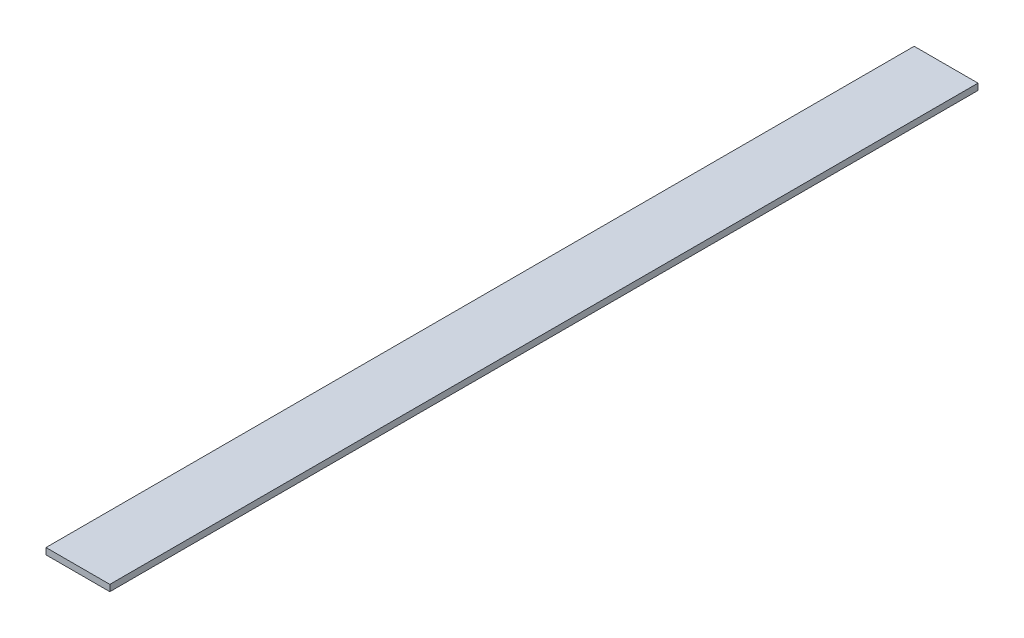
ISO-10303-21;
HEADER;
FILE_DESCRIPTION(('STEP AP214'),'2;1');
FILE_NAME('part.step','',(''),(''),'','','');
FILE_SCHEMA(('AUTOMOTIVE_DESIGN { 1 0 10303 214 1 1 1 1 }'));
ENDSEC;
DATA;
#1=APPLICATION_CONTEXT('core data for automotive mechanical design processes');
#2=APPLICATION_PROTOCOL_DEFINITION('international standard','automotive_design',2000,#1);
#3=PRODUCT_CONTEXT('',#1,'mechanical');
#4=PRODUCT('Part','Part','',(#3));
#5=PRODUCT_RELATED_PRODUCT_CATEGORY('part','',(#4));
#6=PRODUCT_DEFINITION_FORMATION('','',#4);
#7=PRODUCT_DEFINITION_CONTEXT('part definition',#1,'design');
#8=PRODUCT_DEFINITION('design','',#6,#7);
#9=PRODUCT_DEFINITION_SHAPE('','',#8);
#10=(LENGTH_UNIT() NAMED_UNIT(*) SI_UNIT(.MILLI.,.METRE.));
#11=(NAMED_UNIT(*) PLANE_ANGLE_UNIT() SI_UNIT($,.RADIAN.));
#12=(NAMED_UNIT(*) SI_UNIT($,.STERADIAN.) SOLID_ANGLE_UNIT());
#13=UNCERTAINTY_MEASURE_WITH_UNIT(LENGTH_MEASURE(1.E-05),#10,'distance_accuracy_value','');
#14=(GEOMETRIC_REPRESENTATION_CONTEXT(3) GLOBAL_UNCERTAINTY_ASSIGNED_CONTEXT((#13)) GLOBAL_UNIT_ASSIGNED_CONTEXT((#10,
#11,#12)) REPRESENTATION_CONTEXT('',''));
#15=CARTESIAN_POINT('',(0.,0.,0.));
#16=DIRECTION('',(0.,0.,1.));
#17=DIRECTION('',(1.,0.,0.));
#18=AXIS2_PLACEMENT_3D('',#15,#16,#17);
#19=CARTESIAN_POINT('',(0.,0.,680.));
#20=DIRECTION('',(1.,0.,0.));
#21=DIRECTION('',(0.,0.,-1.));
#22=AXIS2_PLACEMENT_3D('',#19,#20,#21);
#23=PLANE('',#22);
#24=DIRECTION('',(0.,-1.,0.));
#25=VECTOR('',#24,1.);
#26=CARTESIAN_POINT('',(0.,0.,0.));
#27=LINE('',#26,#25);
#28=CARTESIAN_POINT('',(0.,5.,0.));
#29=VERTEX_POINT('',#28);
#30=CARTESIAN_POINT('',(0.,0.,0.));
#31=VERTEX_POINT('',#30);
#32=EDGE_CURVE('E98',#29,#31,#27,.T.);
#33=ORIENTED_EDGE('',*,*,#32,.T.);
#34=DIRECTION('',(0.,0.,-1.));
#35=VECTOR('',#34,1.);
#36=CARTESIAN_POINT('',(0.,0.,680.));
#37=LINE('',#36,#35);
#38=CARTESIAN_POINT('',(0.,0.,680.));
#39=VERTEX_POINT('',#38);
#40=EDGE_CURVE('E11',#39,#31,#37,.T.);
#41=ORIENTED_EDGE('',*,*,#40,.F.);
#42=DIRECTION('',(0.,-1.,0.));
#43=VECTOR('',#42,1.);
#44=CARTESIAN_POINT('',(0.,0.,680.));
#45=LINE('',#44,#43);
#46=CARTESIAN_POINT('',(0.,5.,680.));
#47=VERTEX_POINT('',#46);
#48=EDGE_CURVE('E85',#47,#39,#45,.T.);
#49=ORIENTED_EDGE('',*,*,#48,.F.);
#50=DIRECTION('',(0.,0.,-1.));
#51=VECTOR('',#50,1.);
#52=CARTESIAN_POINT('',(0.,5.,680.));
#53=LINE('',#52,#51);
#54=EDGE_CURVE('E94',#47,#29,#53,.T.);
#55=ORIENTED_EDGE('',*,*,#54,.T.);
#56=EDGE_LOOP('',(#33,#41,#49,#55));
#57=FACE_BOUND('',#56,.T.);
#58=ADVANCED_FACE('F34',(#57),#23,.F.);
#59=CARTESIAN_POINT('',(0.,0.,680.));
#60=DIRECTION('',(0.,1.,0.));
#61=DIRECTION('',(0.,0.,1.));
#62=AXIS2_PLACEMENT_3D('',#59,#60,#61);
#63=PLANE('',#62);
#64=DIRECTION('',(1.,0.,0.));
#65=VECTOR('',#64,1.);
#66=CARTESIAN_POINT('',(0.,0.,0.));
#67=LINE('',#66,#65);
#68=CARTESIAN_POINT('',(50.,0.,0.));
#69=VERTEX_POINT('',#68);
#70=EDGE_CURVE('E89',#31,#69,#67,.T.);
#71=ORIENTED_EDGE('',*,*,#70,.T.);
#72=DIRECTION('',(0.,0.,-1.));
#73=VECTOR('',#72,1.);
#74=CARTESIAN_POINT('',(50.,0.,680.));
#75=LINE('',#74,#73);
#76=CARTESIAN_POINT('',(50.,0.,680.));
#77=VERTEX_POINT('',#76);
#78=EDGE_CURVE('E42',#77,#69,#75,.T.);
#79=ORIENTED_EDGE('',*,*,#78,.F.);
#80=DIRECTION('',(1.,0.,0.));
#81=VECTOR('',#80,1.);
#82=CARTESIAN_POINT('',(0.,0.,680.));
#83=LINE('',#82,#81);
#84=EDGE_CURVE('E80',#39,#77,#83,.T.);
#85=ORIENTED_EDGE('',*,*,#84,.F.);
#86=ORIENTED_EDGE('',*,*,#40,.T.);
#87=EDGE_LOOP('',(#71,#79,#85,#86));
#88=FACE_BOUND('',#87,.T.);
#89=ADVANCED_FACE('F88',(#88),#63,.F.);
#90=CARTESIAN_POINT('',(50.,0.,680.));
#91=DIRECTION('',(-1.,0.,0.));
#92=DIRECTION('',(0.,0.,1.));
#93=AXIS2_PLACEMENT_3D('',#90,#91,#92);
#94=PLANE('',#93);
#95=DIRECTION('',(0.,1.,0.));
#96=VECTOR('',#95,1.);
#97=CARTESIAN_POINT('',(50.,0.,0.));
#98=LINE('',#97,#96);
#99=CARTESIAN_POINT('',(50.,5.,0.));
#100=VERTEX_POINT('',#99);
#101=EDGE_CURVE('E67',#69,#100,#98,.T.);
#102=ORIENTED_EDGE('',*,*,#101,.T.);
#103=DIRECTION('',(0.,0.,-1.));
#104=VECTOR('',#103,1.);
#105=CARTESIAN_POINT('',(50.,5.,680.));
#106=LINE('',#105,#104);
#107=CARTESIAN_POINT('',(50.,5.,680.));
#108=VERTEX_POINT('',#107);
#109=EDGE_CURVE('E91',#108,#100,#106,.T.);
#110=ORIENTED_EDGE('',*,*,#109,.F.);
#111=DIRECTION('',(0.,1.,0.));
#112=VECTOR('',#111,1.);
#113=CARTESIAN_POINT('',(50.,0.,680.));
#114=LINE('',#113,#112);
#115=EDGE_CURVE('E83',#77,#108,#114,.T.);
#116=ORIENTED_EDGE('',*,*,#115,.F.);
#117=ORIENTED_EDGE('',*,*,#78,.T.);
#118=EDGE_LOOP('',(#102,#110,#116,#117));
#119=FACE_BOUND('',#118,.T.);
#120=ADVANCED_FACE('F92',(#119),#94,.F.);
#121=CARTESIAN_POINT('',(0.,5.,680.));
#122=DIRECTION('',(0.,-1.,0.));
#123=DIRECTION('',(0.,0.,-1.));
#124=AXIS2_PLACEMENT_3D('',#121,#122,#123);
#125=PLANE('',#124);
#126=DIRECTION('',(-1.,0.,0.));
#127=VECTOR('',#126,1.);
#128=CARTESIAN_POINT('',(0.,5.,0.));
#129=LINE('',#128,#127);
#130=EDGE_CURVE('E73',#100,#29,#129,.T.);
#131=ORIENTED_EDGE('',*,*,#130,.T.);
#132=ORIENTED_EDGE('',*,*,#54,.F.);
#133=DIRECTION('',(-1.,0.,0.));
#134=VECTOR('',#133,1.);
#135=CARTESIAN_POINT('',(0.,5.,680.));
#136=LINE('',#135,#134);
#137=EDGE_CURVE('E50',#108,#47,#136,.T.);
#138=ORIENTED_EDGE('',*,*,#137,.F.);
#139=ORIENTED_EDGE('',*,*,#109,.T.);
#140=EDGE_LOOP('',(#131,#132,#138,#139));
#141=FACE_BOUND('',#140,.T.);
#142=ADVANCED_FACE('F105',(#141),#125,.F.);
#143=CARTESIAN_POINT('',(0.,0.,680.));
#144=DIRECTION('',(0.,0.,-1.));
#145=DIRECTION('',(-1.,0.,0.));
#146=AXIS2_PLACEMENT_3D('',#143,#144,#145);
#147=PLANE('',#146);
#148=ORIENTED_EDGE('',*,*,#48,.T.);
#149=ORIENTED_EDGE('',*,*,#84,.T.);
#150=ORIENTED_EDGE('',*,*,#115,.T.);
#151=ORIENTED_EDGE('',*,*,#137,.T.);
#152=EDGE_LOOP('',(#148,#149,#150,#151));
#153=FACE_BOUND('',#152,.T.);
#154=ADVANCED_FACE('F81',(#153),#147,.F.);
#155=CARTESIAN_POINT('',(0.,0.,0.));
#156=DIRECTION('',(0.,0.,-1.));
#157=DIRECTION('',(-1.,0.,0.));
#158=AXIS2_PLACEMENT_3D('',#155,#156,#157);
#159=PLANE('',#158);
#160=ORIENTED_EDGE('',*,*,#32,.F.);
#161=ORIENTED_EDGE('',*,*,#130,.F.);
#162=ORIENTED_EDGE('',*,*,#101,.F.);
#163=ORIENTED_EDGE('',*,*,#70,.F.);
#164=EDGE_LOOP('',(#160,#161,#162,#163));
#165=FACE_BOUND('',#164,.T.);
#166=ADVANCED_FACE('F108',(#165),#159,.T.);
#167=CLOSED_SHELL('',(#58,#89,#120,#142,#154,#166));
#168=MANIFOLD_SOLID_BREP('B2',#167);
#169=ADVANCED_BREP_SHAPE_REPRESENTATION('',(#18,#168),#14);
#170=SHAPE_DEFINITION_REPRESENTATION(#9,#169);
ENDSEC;
END-ISO-10303-21;
